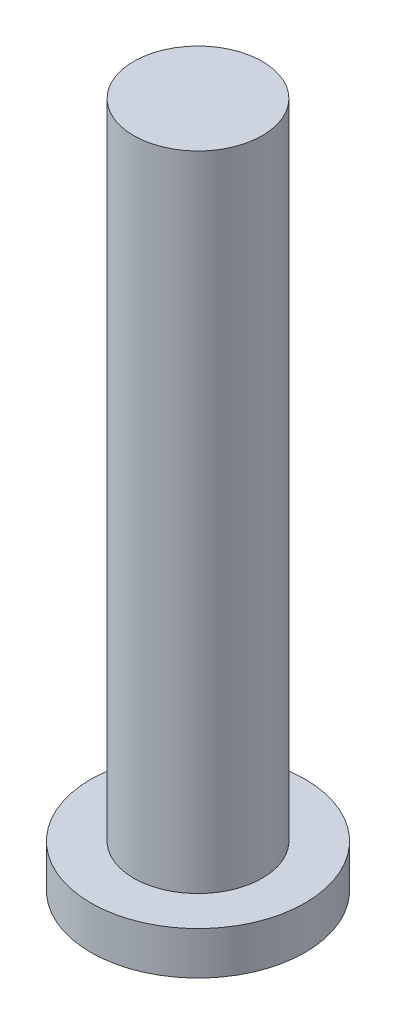
ISO-10303-21;
HEADER;
FILE_DESCRIPTION(('STEP AP214'),'2;1');
FILE_NAME('part.step','',(''),(''),'','','');
FILE_SCHEMA(('AUTOMOTIVE_DESIGN { 1 0 10303 214 1 1 1 1 }'));
ENDSEC;
DATA;
#1=APPLICATION_CONTEXT('core data for automotive mechanical design processes');
#2=APPLICATION_PROTOCOL_DEFINITION('international standard','automotive_design',2000,#1);
#3=PRODUCT_CONTEXT('',#1,'mechanical');
#4=PRODUCT('Part','Part','',(#3));
#5=PRODUCT_RELATED_PRODUCT_CATEGORY('part','',(#4));
#6=PRODUCT_DEFINITION_FORMATION('','',#4);
#7=PRODUCT_DEFINITION_CONTEXT('part definition',#1,'design');
#8=PRODUCT_DEFINITION('design','',#6,#7);
#9=PRODUCT_DEFINITION_SHAPE('','',#8);
#10=(LENGTH_UNIT() NAMED_UNIT(*) SI_UNIT(.MILLI.,.METRE.));
#11=(NAMED_UNIT(*) PLANE_ANGLE_UNIT() SI_UNIT($,.RADIAN.));
#12=(NAMED_UNIT(*) SI_UNIT($,.STERADIAN.) SOLID_ANGLE_UNIT());
#13=UNCERTAINTY_MEASURE_WITH_UNIT(LENGTH_MEASURE(1.E-05),#10,'distance_accuracy_value','');
#14=(GEOMETRIC_REPRESENTATION_CONTEXT(3) GLOBAL_UNCERTAINTY_ASSIGNED_CONTEXT((#13)) GLOBAL_UNIT_ASSIGNED_CONTEXT((#10,
#11,#12)) REPRESENTATION_CONTEXT('',''));
#15=CARTESIAN_POINT('',(0.,0.,0.));
#16=DIRECTION('',(0.,0.,1.));
#17=DIRECTION('',(1.,0.,0.));
#18=AXIS2_PLACEMENT_3D('',#15,#16,#17);
#19=CARTESIAN_POINT('',(0.,1.,0.));
#20=DIRECTION('',(0.,1.,0.));
#21=DIRECTION('',(0.,0.,1.));
#22=AXIS2_PLACEMENT_3D('',#19,#20,#21);
#23=PLANE('',#22);
#24=CARTESIAN_POINT('',(0.,1.,0.));
#25=DIRECTION('',(0.,1.,0.));
#26=DIRECTION('',(0.,0.,1.));
#27=AXIS2_PLACEMENT_3D('',#24,#25,#26);
#28=CIRCLE('',#27,2.5);
#29=CARTESIAN_POINT('',(0.,1.,2.5));
#30=VERTEX_POINT('',#29);
#31=EDGE_CURVE('E10',#30,#30,#28,.T.);
#32=ORIENTED_EDGE('',*,*,#31,.T.);
#33=EDGE_LOOP('',(#32));
#34=FACE_BOUND('',#33,.T.);
#35=CARTESIAN_POINT('',(0.,1.,0.));
#36=DIRECTION('',(0.,1.,0.));
#37=DIRECTION('',(0.,0.,1.));
#38=AXIS2_PLACEMENT_3D('',#35,#36,#37);
#39=CIRCLE('',#38,1.5);
#40=CARTESIAN_POINT('',(0.,1.,1.5));
#41=VERTEX_POINT('',#40);
#42=EDGE_CURVE('E42',#41,#41,#39,.T.);
#43=ORIENTED_EDGE('',*,*,#42,.F.);
#44=EDGE_LOOP('',(#43));
#45=FACE_BOUND('',#44,.T.);
#46=ADVANCED_FACE('F29',(#34,#45),#23,.T.);
#47=CARTESIAN_POINT('',(0.,1.,0.));
#48=DIRECTION('',(0.,-1.,0.));
#49=DIRECTION('',(0.,0.,-1.));
#50=AXIS2_PLACEMENT_3D('',#47,#48,#49);
#51=CYLINDRICAL_SURFACE('',#50,2.5);
#52=ORIENTED_EDGE('',*,*,#31,.F.);
#53=EDGE_LOOP('',(#52));
#54=FACE_BOUND('',#53,.T.);
#55=CARTESIAN_POINT('',(0.,0.,0.));
#56=DIRECTION('',(0.,1.,0.));
#57=DIRECTION('',(0.,0.,1.));
#58=AXIS2_PLACEMENT_3D('',#55,#56,#57);
#59=CIRCLE('',#58,2.5);
#60=CARTESIAN_POINT('',(0.,0.,2.5));
#61=VERTEX_POINT('',#60);
#62=EDGE_CURVE('E33',#61,#61,#59,.T.);
#63=ORIENTED_EDGE('',*,*,#62,.T.);
#64=EDGE_LOOP('',(#63));
#65=FACE_BOUND('',#64,.T.);
#66=ADVANCED_FACE('F31',(#54,#65),#51,.T.);
#67=CARTESIAN_POINT('',(0.,0.,0.));
#68=DIRECTION('',(0.,1.,0.));
#69=DIRECTION('',(0.,0.,1.));
#70=AXIS2_PLACEMENT_3D('',#67,#68,#69);
#71=PLANE('',#70);
#72=ORIENTED_EDGE('',*,*,#62,.F.);
#73=EDGE_LOOP('',(#72));
#74=FACE_BOUND('',#73,.T.);
#75=ADVANCED_FACE('F53',(#74),#71,.F.);
#76=CARTESIAN_POINT('',(0.,16.,0.));
#77=DIRECTION('',(0.,-1.,0.));
#78=DIRECTION('',(0.,0.,-1.));
#79=AXIS2_PLACEMENT_3D('',#76,#77,#78);
#80=CYLINDRICAL_SURFACE('',#79,1.5);
#81=CARTESIAN_POINT('',(0.,16.,0.));
#82=DIRECTION('',(0.,1.,0.));
#83=DIRECTION('',(0.,0.,1.));
#84=AXIS2_PLACEMENT_3D('',#81,#82,#83);
#85=CIRCLE('',#84,1.5);
#86=CARTESIAN_POINT('',(0.,16.,1.5));
#87=VERTEX_POINT('',#86);
#88=EDGE_CURVE('E40',#87,#87,#85,.T.);
#89=ORIENTED_EDGE('',*,*,#88,.F.);
#90=EDGE_LOOP('',(#89));
#91=FACE_BOUND('',#90,.T.);
#92=ORIENTED_EDGE('',*,*,#42,.T.);
#93=EDGE_LOOP('',(#92));
#94=FACE_BOUND('',#93,.T.);
#95=ADVANCED_FACE('F50',(#91,#94),#80,.T.);
#96=CARTESIAN_POINT('',(0.,16.,0.));
#97=DIRECTION('',(0.,1.,0.));
#98=DIRECTION('',(0.,0.,1.));
#99=AXIS2_PLACEMENT_3D('',#96,#97,#98);
#100=PLANE('',#99);
#101=ORIENTED_EDGE('',*,*,#88,.T.);
#102=EDGE_LOOP('',(#101));
#103=FACE_BOUND('',#102,.T.);
#104=ADVANCED_FACE('F48',(#103),#100,.T.);
#105=CLOSED_SHELL('',(#46,#66,#75,#95,#104));
#106=MANIFOLD_SOLID_BREP('B2',#105);
#107=ADVANCED_BREP_SHAPE_REPRESENTATION('',(#18,#106),#14);
#108=SHAPE_DEFINITION_REPRESENTATION(#9,#107);
ENDSEC;
END-ISO-10303-21;
